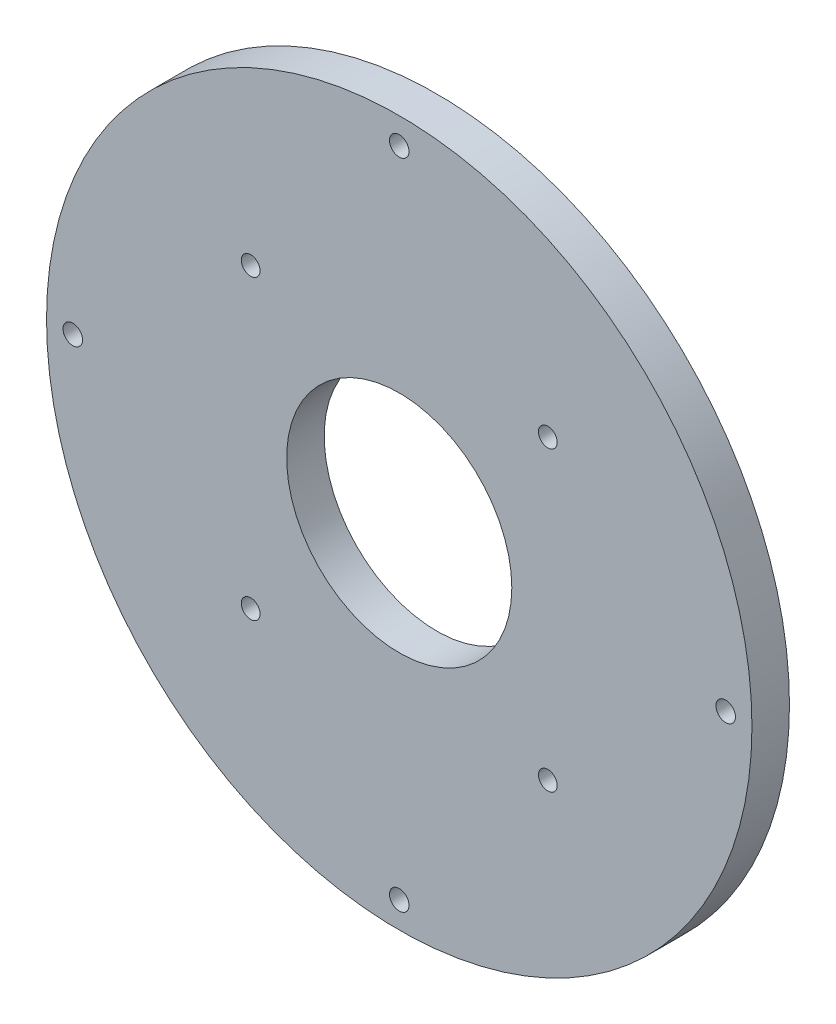
ISO-10303-21;
HEADER;
FILE_DESCRIPTION(('STEP AP214'),'2;1');
FILE_NAME('part.step','',(''),(''),'','','');
FILE_SCHEMA(('AUTOMOTIVE_DESIGN { 1 0 10303 214 1 1 1 1 }'));
ENDSEC;
DATA;
#1=APPLICATION_CONTEXT('core data for automotive mechanical design processes');
#2=APPLICATION_PROTOCOL_DEFINITION('international standard','automotive_design',2000,#1);
#3=PRODUCT_CONTEXT('',#1,'mechanical');
#4=PRODUCT('Part','Part','',(#3));
#5=PRODUCT_RELATED_PRODUCT_CATEGORY('part','',(#4));
#6=PRODUCT_DEFINITION_FORMATION('','',#4);
#7=PRODUCT_DEFINITION_CONTEXT('part definition',#1,'design');
#8=PRODUCT_DEFINITION('design','',#6,#7);
#9=PRODUCT_DEFINITION_SHAPE('','',#8);
#10=(LENGTH_UNIT() NAMED_UNIT(*) SI_UNIT(.MILLI.,.METRE.));
#11=(NAMED_UNIT(*) PLANE_ANGLE_UNIT() SI_UNIT($,.RADIAN.));
#12=(NAMED_UNIT(*) SI_UNIT($,.STERADIAN.) SOLID_ANGLE_UNIT());
#13=UNCERTAINTY_MEASURE_WITH_UNIT(LENGTH_MEASURE(1.E-05),#10,'distance_accuracy_value','');
#14=(GEOMETRIC_REPRESENTATION_CONTEXT(3) GLOBAL_UNCERTAINTY_ASSIGNED_CONTEXT((#13)) GLOBAL_UNIT_ASSIGNED_CONTEXT((#10,
#11,#12)) REPRESENTATION_CONTEXT('',''));
#15=CARTESIAN_POINT('',(0.,0.,0.));
#16=DIRECTION('',(0.,0.,1.));
#17=DIRECTION('',(1.,0.,0.));
#18=AXIS2_PLACEMENT_3D('',#15,#16,#17);
#19=CARTESIAN_POINT('',(0.,0.,5.));
#20=DIRECTION('',(0.,0.,1.));
#21=DIRECTION('',(1.,0.,0.));
#22=AXIS2_PLACEMENT_3D('',#19,#20,#21);
#23=PLANE('',#22);
#24=CARTESIAN_POINT('',(19.7989898732244,-19.7989898732222,5.));
#25=DIRECTION('',(0.,0.,1.));
#26=DIRECTION('',(1.,0.,0.));
#27=AXIS2_PLACEMENT_3D('',#24,#25,#26);
#28=CIRCLE('',#27,1.25);
#29=CARTESIAN_POINT('',(21.0489898732244,-19.7989898732222,5.));
#30=VERTEX_POINT('',#29);
#31=EDGE_CURVE('E83',#30,#30,#28,.T.);
#32=ORIENTED_EDGE('',*,*,#31,.F.);
#33=EDGE_LOOP('',(#32));
#34=FACE_BOUND('',#33,.T.);
#35=CARTESIAN_POINT('',(-19.7989898732232,19.7989898732234,5.));
#36=DIRECTION('',(0.,0.,1.));
#37=DIRECTION('',(1.,0.,0.));
#38=AXIS2_PLACEMENT_3D('',#35,#36,#37);
#39=CIRCLE('',#38,1.25);
#40=CARTESIAN_POINT('',(-18.5489898732232,19.7989898732234,5.));
#41=VERTEX_POINT('',#40);
#42=EDGE_CURVE('E71',#41,#41,#39,.T.);
#43=ORIENTED_EDGE('',*,*,#42,.F.);
#44=EDGE_LOOP('',(#43));
#45=FACE_BOUND('',#44,.T.);
#46=CARTESIAN_POINT('',(2.46203429329257E-12,-43.5,5.));
#47=DIRECTION('',(0.,0.,1.));
#48=DIRECTION('',(1.,0.,0.));
#49=AXIS2_PLACEMENT_3D('',#46,#47,#48);
#50=CIRCLE('',#49,1.30000000000265);
#51=CARTESIAN_POINT('',(1.30000000000511,-43.5,5.));
#52=VERTEX_POINT('',#51);
#53=EDGE_CURVE('E59',#52,#52,#50,.T.);
#54=ORIENTED_EDGE('',*,*,#53,.F.);
#55=EDGE_LOOP('',(#54));
#56=FACE_BOUND('',#55,.T.);
#57=CARTESIAN_POINT('',(0.,0.,5.));
#58=DIRECTION('',(0.,0.,1.));
#59=DIRECTION('',(1.,0.,0.));
#60=AXIS2_PLACEMENT_3D('',#57,#58,#59);
#61=CIRCLE('',#60,15.);
#62=CARTESIAN_POINT('',(15.,0.,5.));
#63=VERTEX_POINT('',#62);
#64=EDGE_CURVE('E47',#63,#63,#61,.T.);
#65=ORIENTED_EDGE('',*,*,#64,.F.);
#66=EDGE_LOOP('',(#65));
#67=FACE_BOUND('',#66,.T.);
#68=CARTESIAN_POINT('',(0.,0.,5.));
#69=DIRECTION('',(0.,0.,1.));
#70=DIRECTION('',(1.,0.,0.));
#71=AXIS2_PLACEMENT_3D('',#68,#69,#70);
#72=CIRCLE('',#71,47.);
#73=CARTESIAN_POINT('',(47.,0.,5.));
#74=VERTEX_POINT('',#73);
#75=EDGE_CURVE('E10',#74,#74,#72,.T.);
#76=ORIENTED_EDGE('',*,*,#75,.T.);
#77=EDGE_LOOP('',(#76));
#78=FACE_BOUND('',#77,.T.);
#79=CARTESIAN_POINT('',(0.,43.5,5.));
#80=DIRECTION('',(0.,0.,1.));
#81=DIRECTION('',(1.,0.,0.));
#82=AXIS2_PLACEMENT_3D('',#79,#80,#81);
#83=CIRCLE('',#82,1.3);
#84=CARTESIAN_POINT('',(1.3,43.5,5.));
#85=VERTEX_POINT('',#84);
#86=EDGE_CURVE('E42',#85,#85,#83,.T.);
#87=ORIENTED_EDGE('',*,*,#86,.F.);
#88=EDGE_LOOP('',(#87));
#89=FACE_BOUND('',#88,.T.);
#90=CARTESIAN_POINT('',(43.5000000000012,1.23101714664628E-12,5.));
#91=DIRECTION('',(0.,0.,1.));
#92=DIRECTION('',(1.,0.,0.));
#93=AXIS2_PLACEMENT_3D('',#90,#91,#92);
#94=CIRCLE('',#93,1.30000000000096);
#95=CARTESIAN_POINT('',(44.8000000000022,1.23101714664628E-12,5.));
#96=VERTEX_POINT('',#95);
#97=EDGE_CURVE('E53',#96,#96,#94,.T.);
#98=ORIENTED_EDGE('',*,*,#97,.F.);
#99=EDGE_LOOP('',(#98));
#100=FACE_BOUND('',#99,.T.);
#101=CARTESIAN_POINT('',(-43.4999999999988,-1.23634436022257E-12,5.));
#102=DIRECTION('',(0.,0.,1.));
#103=DIRECTION('',(1.,0.,0.));
#104=AXIS2_PLACEMENT_3D('',#101,#102,#103);
#105=CIRCLE('',#104,1.30000000000198);
#106=CARTESIAN_POINT('',(-42.1999999999968,-1.23634436022257E-12,5.));
#107=VERTEX_POINT('',#106);
#108=EDGE_CURVE('E65',#107,#107,#105,.T.);
#109=ORIENTED_EDGE('',*,*,#108,.F.);
#110=EDGE_LOOP('',(#109));
#111=FACE_BOUND('',#110,.T.);
#112=CARTESIAN_POINT('',(19.7989898732234,19.7989898732244,5.));
#113=DIRECTION('',(0.,0.,1.));
#114=DIRECTION('',(1.,0.,0.));
#115=AXIS2_PLACEMENT_3D('',#112,#113,#114);
#116=CIRCLE('',#115,1.25);
#117=CARTESIAN_POINT('',(21.0489898732234,19.7989898732244,5.));
#118=VERTEX_POINT('',#117);
#119=EDGE_CURVE('E77',#118,#118,#116,.T.);
#120=ORIENTED_EDGE('',*,*,#119,.F.);
#121=EDGE_LOOP('',(#120));
#122=FACE_BOUND('',#121,.T.);
#123=CARTESIAN_POINT('',(-19.7989898732222,-19.7989898732232,5.));
#124=DIRECTION('',(0.,0.,1.));
#125=DIRECTION('',(1.,0.,0.));
#126=AXIS2_PLACEMENT_3D('',#123,#124,#125);
#127=CIRCLE('',#126,1.25);
#128=CARTESIAN_POINT('',(-18.5489898732222,-19.7989898732232,5.));
#129=VERTEX_POINT('',#128);
#130=EDGE_CURVE('E89',#129,#129,#127,.T.);
#131=ORIENTED_EDGE('',*,*,#130,.F.);
#132=EDGE_LOOP('',(#131));
#133=FACE_BOUND('',#132,.T.);
#134=ADVANCED_FACE('F31',(#34,#45,#56,#67,#78,#89,#100,#111,#122,#133),#23,.T.);
#135=CARTESIAN_POINT('',(0.,0.,0.));
#136=DIRECTION('',(0.,0.,1.));
#137=DIRECTION('',(1.,0.,0.));
#138=AXIS2_PLACEMENT_3D('',#135,#136,#137);
#139=PLANE('',#138);
#140=CARTESIAN_POINT('',(0.,0.,0.));
#141=DIRECTION('',(0.,0.,1.));
#142=DIRECTION('',(1.,0.,0.));
#143=AXIS2_PLACEMENT_3D('',#140,#141,#142);
#144=CIRCLE('',#143,47.);
#145=CARTESIAN_POINT('',(47.,0.,0.));
#146=VERTEX_POINT('',#145);
#147=EDGE_CURVE('E35',#146,#146,#144,.T.);
#148=ORIENTED_EDGE('',*,*,#147,.F.);
#149=EDGE_LOOP('',(#148));
#150=FACE_BOUND('',#149,.T.);
#151=CARTESIAN_POINT('',(0.,43.5,0.));
#152=DIRECTION('',(0.,0.,1.));
#153=DIRECTION('',(1.,0.,0.));
#154=AXIS2_PLACEMENT_3D('',#151,#152,#153);
#155=CIRCLE('',#154,1.3);
#156=CARTESIAN_POINT('',(1.3,43.5,0.));
#157=VERTEX_POINT('',#156);
#158=EDGE_CURVE('E44',#157,#157,#155,.T.);
#159=ORIENTED_EDGE('',*,*,#158,.T.);
#160=EDGE_LOOP('',(#159));
#161=FACE_BOUND('',#160,.T.);
#162=CARTESIAN_POINT('',(0.,0.,0.));
#163=DIRECTION('',(0.,0.,1.));
#164=DIRECTION('',(1.,0.,0.));
#165=AXIS2_PLACEMENT_3D('',#162,#163,#164);
#166=CIRCLE('',#165,15.);
#167=CARTESIAN_POINT('',(15.,0.,0.));
#168=VERTEX_POINT('',#167);
#169=EDGE_CURVE('E50',#168,#168,#166,.T.);
#170=ORIENTED_EDGE('',*,*,#169,.T.);
#171=EDGE_LOOP('',(#170));
#172=FACE_BOUND('',#171,.T.);
#173=CARTESIAN_POINT('',(43.5000000000012,1.23101714664628E-12,0.));
#174=DIRECTION('',(0.,0.,1.));
#175=DIRECTION('',(1.,0.,0.));
#176=AXIS2_PLACEMENT_3D('',#173,#174,#175);
#177=CIRCLE('',#176,1.30000000000096);
#178=CARTESIAN_POINT('',(44.8000000000022,1.23101714664628E-12,0.));
#179=VERTEX_POINT('',#178);
#180=EDGE_CURVE('E56',#179,#179,#177,.T.);
#181=ORIENTED_EDGE('',*,*,#180,.T.);
#182=EDGE_LOOP('',(#181));
#183=FACE_BOUND('',#182,.T.);
#184=CARTESIAN_POINT('',(2.46203429329257E-12,-43.5,0.));
#185=DIRECTION('',(0.,0.,1.));
#186=DIRECTION('',(1.,0.,0.));
#187=AXIS2_PLACEMENT_3D('',#184,#185,#186);
#188=CIRCLE('',#187,1.30000000000265);
#189=CARTESIAN_POINT('',(1.30000000000511,-43.5,0.));
#190=VERTEX_POINT('',#189);
#191=EDGE_CURVE('E62',#190,#190,#188,.T.);
#192=ORIENTED_EDGE('',*,*,#191,.T.);
#193=EDGE_LOOP('',(#192));
#194=FACE_BOUND('',#193,.T.);
#195=CARTESIAN_POINT('',(-43.4999999999988,-1.23634436022257E-12,0.));
#196=DIRECTION('',(0.,0.,1.));
#197=DIRECTION('',(1.,0.,0.));
#198=AXIS2_PLACEMENT_3D('',#195,#196,#197);
#199=CIRCLE('',#198,1.30000000000198);
#200=CARTESIAN_POINT('',(-42.1999999999968,-1.23634436022257E-12,0.));
#201=VERTEX_POINT('',#200);
#202=EDGE_CURVE('E68',#201,#201,#199,.T.);
#203=ORIENTED_EDGE('',*,*,#202,.T.);
#204=EDGE_LOOP('',(#203));
#205=FACE_BOUND('',#204,.T.);
#206=CARTESIAN_POINT('',(-19.7989898732232,19.7989898732234,0.));
#207=DIRECTION('',(0.,0.,1.));
#208=DIRECTION('',(1.,0.,0.));
#209=AXIS2_PLACEMENT_3D('',#206,#207,#208);
#210=CIRCLE('',#209,1.25);
#211=CARTESIAN_POINT('',(-18.5489898732232,19.7989898732234,0.));
#212=VERTEX_POINT('',#211);
#213=EDGE_CURVE('E74',#212,#212,#210,.T.);
#214=ORIENTED_EDGE('',*,*,#213,.T.);
#215=EDGE_LOOP('',(#214));
#216=FACE_BOUND('',#215,.T.);
#217=CARTESIAN_POINT('',(19.7989898732234,19.7989898732244,0.));
#218=DIRECTION('',(0.,0.,1.));
#219=DIRECTION('',(1.,0.,0.));
#220=AXIS2_PLACEMENT_3D('',#217,#218,#219);
#221=CIRCLE('',#220,1.25);
#222=CARTESIAN_POINT('',(21.0489898732234,19.7989898732244,0.));
#223=VERTEX_POINT('',#222);
#224=EDGE_CURVE('E80',#223,#223,#221,.T.);
#225=ORIENTED_EDGE('',*,*,#224,.T.);
#226=EDGE_LOOP('',(#225));
#227=FACE_BOUND('',#226,.T.);
#228=CARTESIAN_POINT('',(19.7989898732244,-19.7989898732222,0.));
#229=DIRECTION('',(0.,0.,1.));
#230=DIRECTION('',(1.,0.,0.));
#231=AXIS2_PLACEMENT_3D('',#228,#229,#230);
#232=CIRCLE('',#231,1.25);
#233=CARTESIAN_POINT('',(21.0489898732244,-19.7989898732222,0.));
#234=VERTEX_POINT('',#233);
#235=EDGE_CURVE('E86',#234,#234,#232,.T.);
#236=ORIENTED_EDGE('',*,*,#235,.T.);
#237=EDGE_LOOP('',(#236));
#238=FACE_BOUND('',#237,.T.);
#239=CARTESIAN_POINT('',(-19.7989898732222,-19.7989898732232,0.));
#240=DIRECTION('',(0.,0.,1.));
#241=DIRECTION('',(1.,0.,0.));
#242=AXIS2_PLACEMENT_3D('',#239,#240,#241);
#243=CIRCLE('',#242,1.25);
#244=CARTESIAN_POINT('',(-18.5489898732222,-19.7989898732232,0.));
#245=VERTEX_POINT('',#244);
#246=EDGE_CURVE('E92',#245,#245,#243,.T.);
#247=ORIENTED_EDGE('',*,*,#246,.T.);
#248=EDGE_LOOP('',(#247));
#249=FACE_BOUND('',#248,.T.);
#250=ADVANCED_FACE('F102',(#150,#161,#172,#183,#194,#205,#216,#227,#238,#249),#139,.F.);
#251=CARTESIAN_POINT('',(0.,0.,5.));
#252=DIRECTION('',(0.,0.,-1.));
#253=DIRECTION('',(-1.,0.,0.));
#254=AXIS2_PLACEMENT_3D('',#251,#252,#253);
#255=CYLINDRICAL_SURFACE('',#254,47.);
#256=ORIENTED_EDGE('',*,*,#75,.F.);
#257=EDGE_LOOP('',(#256));
#258=FACE_BOUND('',#257,.T.);
#259=ORIENTED_EDGE('',*,*,#147,.T.);
#260=EDGE_LOOP('',(#259));
#261=FACE_BOUND('',#260,.T.);
#262=ADVANCED_FACE('F33',(#258,#261),#255,.T.);
#263=CARTESIAN_POINT('',(0.,43.5,5.));
#264=DIRECTION('',(0.,0.,-1.));
#265=DIRECTION('',(-1.,0.,0.));
#266=AXIS2_PLACEMENT_3D('',#263,#264,#265);
#267=CYLINDRICAL_SURFACE('',#266,1.3);
#268=ORIENTED_EDGE('',*,*,#86,.T.);
#269=EDGE_LOOP('',(#268));
#270=FACE_BOUND('',#269,.T.);
#271=ORIENTED_EDGE('',*,*,#158,.F.);
#272=EDGE_LOOP('',(#271));
#273=FACE_BOUND('',#272,.T.);
#274=ADVANCED_FACE('F112',(#270,#273),#267,.F.);
#275=CARTESIAN_POINT('',(0.,0.,5.));
#276=DIRECTION('',(0.,0.,-1.));
#277=DIRECTION('',(-1.,0.,0.));
#278=AXIS2_PLACEMENT_3D('',#275,#276,#277);
#279=CYLINDRICAL_SURFACE('',#278,15.);
#280=ORIENTED_EDGE('',*,*,#64,.T.);
#281=EDGE_LOOP('',(#280));
#282=FACE_BOUND('',#281,.T.);
#283=ORIENTED_EDGE('',*,*,#169,.F.);
#284=EDGE_LOOP('',(#283));
#285=FACE_BOUND('',#284,.T.);
#286=ADVANCED_FACE('F115',(#282,#285),#279,.F.);
#287=CARTESIAN_POINT('',(43.5000000000012,1.23101714664628E-12,5.));
#288=DIRECTION('',(0.,0.,-1.));
#289=DIRECTION('',(-1.,0.,0.));
#290=AXIS2_PLACEMENT_3D('',#287,#288,#289);
#291=CYLINDRICAL_SURFACE('',#290,1.30000000000096);
#292=ORIENTED_EDGE('',*,*,#97,.T.);
#293=EDGE_LOOP('',(#292));
#294=FACE_BOUND('',#293,.T.);
#295=ORIENTED_EDGE('',*,*,#180,.F.);
#296=EDGE_LOOP('',(#295));
#297=FACE_BOUND('',#296,.T.);
#298=ADVANCED_FACE('F119',(#294,#297),#291,.F.);
#299=CARTESIAN_POINT('',(2.46203429329257E-12,-43.5,5.));
#300=DIRECTION('',(0.,0.,-1.));
#301=DIRECTION('',(-1.,0.,0.));
#302=AXIS2_PLACEMENT_3D('',#299,#300,#301);
#303=CYLINDRICAL_SURFACE('',#302,1.30000000000265);
#304=ORIENTED_EDGE('',*,*,#53,.T.);
#305=EDGE_LOOP('',(#304));
#306=FACE_BOUND('',#305,.T.);
#307=ORIENTED_EDGE('',*,*,#191,.F.);
#308=EDGE_LOOP('',(#307));
#309=FACE_BOUND('',#308,.T.);
#310=ADVANCED_FACE('F123',(#306,#309),#303,.F.);
#311=CARTESIAN_POINT('',(-43.4999999999988,-1.23634436022257E-12,5.));
#312=DIRECTION('',(0.,0.,-1.));
#313=DIRECTION('',(-1.,0.,0.));
#314=AXIS2_PLACEMENT_3D('',#311,#312,#313);
#315=CYLINDRICAL_SURFACE('',#314,1.30000000000198);
#316=ORIENTED_EDGE('',*,*,#108,.T.);
#317=EDGE_LOOP('',(#316));
#318=FACE_BOUND('',#317,.T.);
#319=ORIENTED_EDGE('',*,*,#202,.F.);
#320=EDGE_LOOP('',(#319));
#321=FACE_BOUND('',#320,.T.);
#322=ADVANCED_FACE('F127',(#318,#321),#315,.F.);
#323=CARTESIAN_POINT('',(-19.7989898732232,19.7989898732234,5.));
#324=DIRECTION('',(0.,0.,-1.));
#325=DIRECTION('',(-1.,0.,0.));
#326=AXIS2_PLACEMENT_3D('',#323,#324,#325);
#327=CYLINDRICAL_SURFACE('',#326,1.25);
#328=ORIENTED_EDGE('',*,*,#42,.T.);
#329=EDGE_LOOP('',(#328));
#330=FACE_BOUND('',#329,.T.);
#331=ORIENTED_EDGE('',*,*,#213,.F.);
#332=EDGE_LOOP('',(#331));
#333=FACE_BOUND('',#332,.T.);
#334=ADVANCED_FACE('F131',(#330,#333),#327,.F.);
#335=CARTESIAN_POINT('',(19.7989898732234,19.7989898732244,5.));
#336=DIRECTION('',(0.,0.,-1.));
#337=DIRECTION('',(-1.,0.,0.));
#338=AXIS2_PLACEMENT_3D('',#335,#336,#337);
#339=CYLINDRICAL_SURFACE('',#338,1.25);
#340=ORIENTED_EDGE('',*,*,#119,.T.);
#341=EDGE_LOOP('',(#340));
#342=FACE_BOUND('',#341,.T.);
#343=ORIENTED_EDGE('',*,*,#224,.F.);
#344=EDGE_LOOP('',(#343));
#345=FACE_BOUND('',#344,.T.);
#346=ADVANCED_FACE('F135',(#342,#345),#339,.F.);
#347=CARTESIAN_POINT('',(19.7989898732244,-19.7989898732222,5.));
#348=DIRECTION('',(0.,0.,-1.));
#349=DIRECTION('',(-1.,0.,0.));
#350=AXIS2_PLACEMENT_3D('',#347,#348,#349);
#351=CYLINDRICAL_SURFACE('',#350,1.25);
#352=ORIENTED_EDGE('',*,*,#31,.T.);
#353=EDGE_LOOP('',(#352));
#354=FACE_BOUND('',#353,.T.);
#355=ORIENTED_EDGE('',*,*,#235,.F.);
#356=EDGE_LOOP('',(#355));
#357=FACE_BOUND('',#356,.T.);
#358=ADVANCED_FACE('F139',(#354,#357),#351,.F.);
#359=CARTESIAN_POINT('',(-19.7989898732222,-19.7989898732232,5.));
#360=DIRECTION('',(0.,0.,-1.));
#361=DIRECTION('',(-1.,0.,0.));
#362=AXIS2_PLACEMENT_3D('',#359,#360,#361);
#363=CYLINDRICAL_SURFACE('',#362,1.25);
#364=ORIENTED_EDGE('',*,*,#130,.T.);
#365=EDGE_LOOP('',(#364));
#366=FACE_BOUND('',#365,.T.);
#367=ORIENTED_EDGE('',*,*,#246,.F.);
#368=EDGE_LOOP('',(#367));
#369=FACE_BOUND('',#368,.T.);
#370=ADVANCED_FACE('F98',(#366,#369),#363,.F.);
#371=CLOSED_SHELL('',(#134,#250,#262,#274,#286,#298,#310,#322,#334,#346,#358,#370));
#372=MANIFOLD_SOLID_BREP('B2',#371);
#373=ADVANCED_BREP_SHAPE_REPRESENTATION('',(#18,#372),#14);
#374=SHAPE_DEFINITION_REPRESENTATION(#9,#373);
ENDSEC;
END-ISO-10303-21;
